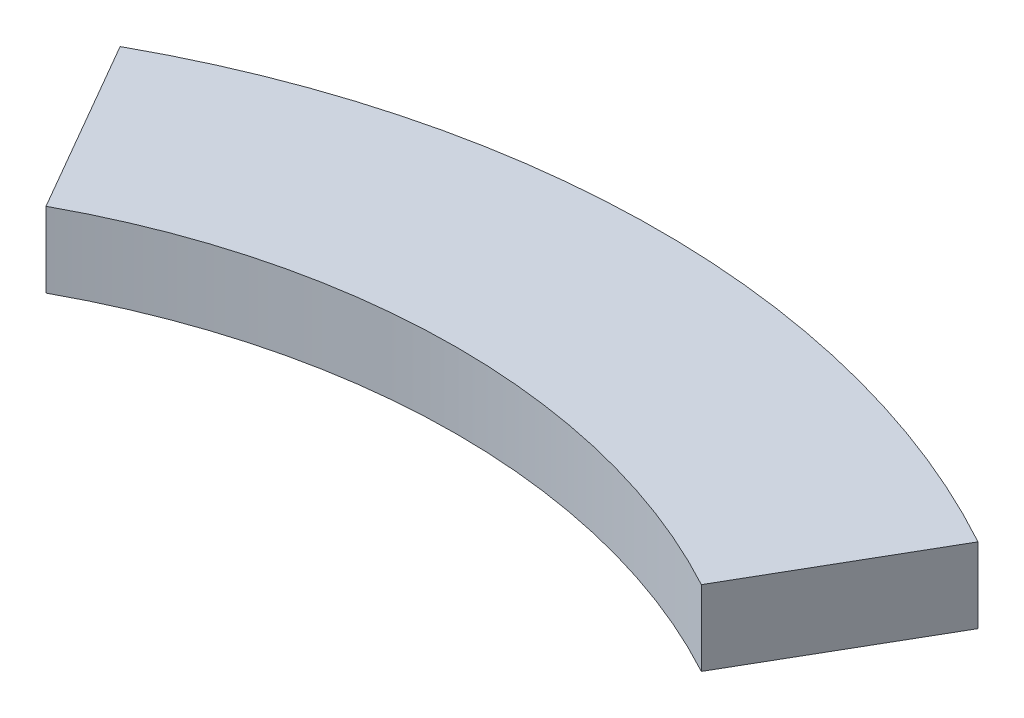
ISO-10303-21;
HEADER;
FILE_DESCRIPTION(('STEP AP214'),'2;1');
FILE_NAME('part.step','',(''),(''),'','','');
FILE_SCHEMA(('AUTOMOTIVE_DESIGN { 1 0 10303 214 1 1 1 1 }'));
ENDSEC;
DATA;
#1=APPLICATION_CONTEXT('core data for automotive mechanical design processes');
#2=APPLICATION_PROTOCOL_DEFINITION('international standard','automotive_design',2000,#1);
#3=PRODUCT_CONTEXT('',#1,'mechanical');
#4=PRODUCT('Part','Part','',(#3));
#5=PRODUCT_RELATED_PRODUCT_CATEGORY('part','',(#4));
#6=PRODUCT_DEFINITION_FORMATION('','',#4);
#7=PRODUCT_DEFINITION_CONTEXT('part definition',#1,'design');
#8=PRODUCT_DEFINITION('design','',#6,#7);
#9=PRODUCT_DEFINITION_SHAPE('','',#8);
#10=(LENGTH_UNIT() NAMED_UNIT(*) SI_UNIT(.MILLI.,.METRE.));
#11=(NAMED_UNIT(*) PLANE_ANGLE_UNIT() SI_UNIT($,.RADIAN.));
#12=(NAMED_UNIT(*) SI_UNIT($,.STERADIAN.) SOLID_ANGLE_UNIT());
#13=UNCERTAINTY_MEASURE_WITH_UNIT(LENGTH_MEASURE(1.E-05),#10,'distance_accuracy_value','');
#14=(GEOMETRIC_REPRESENTATION_CONTEXT(3) GLOBAL_UNCERTAINTY_ASSIGNED_CONTEXT((#13)) GLOBAL_UNIT_ASSIGNED_CONTEXT((#10,
#11,#12)) REPRESENTATION_CONTEXT('',''));
#15=CARTESIAN_POINT('',(0.,0.,0.));
#16=DIRECTION('',(0.,0.,1.));
#17=DIRECTION('',(1.,0.,0.));
#18=AXIS2_PLACEMENT_3D('',#15,#16,#17);
#19=CARTESIAN_POINT('',(0.,3.15,0.));
#20=DIRECTION('',(0.,-1.,0.));
#21=DIRECTION('',(0.,0.,-1.));
#22=AXIS2_PLACEMENT_3D('',#19,#20,#21);
#23=CYLINDRICAL_SURFACE('',#22,37.25);
#24=CARTESIAN_POINT('',(0.,0.,0.));
#25=DIRECTION('',(0.,1.,0.));
#26=DIRECTION('',(0.,0.,-1.));
#27=AXIS2_PLACEMENT_3D('',#24,#25,#26);
#28=CIRCLE('',#27,37.25);
#29=CARTESIAN_POINT('',(17.9717053966978,0.,-32.6279068457403));
#30=VERTEX_POINT('',#29);
#31=CARTESIAN_POINT('',(-17.9717053966979,0.,-32.6279068457402));
#32=VERTEX_POINT('',#31);
#33=EDGE_CURVE('E113',#30,#32,#28,.T.);
#34=ORIENTED_EDGE('',*,*,#33,.T.);
#35=DIRECTION('',(0.,-1.,0.));
#36=VECTOR('',#35,1.);
#37=CARTESIAN_POINT('',(-17.9717053966979,3.15,-32.6279068457402));
#38=LINE('',#37,#36);
#39=CARTESIAN_POINT('',(-17.9717053966979,3.15,-32.6279068457402));
#40=VERTEX_POINT('',#39);
#41=EDGE_CURVE('E11',#40,#32,#38,.T.);
#42=ORIENTED_EDGE('',*,*,#41,.F.);
#43=CARTESIAN_POINT('',(0.,3.15,0.));
#44=DIRECTION('',(0.,1.,0.));
#45=DIRECTION('',(0.,0.,-1.));
#46=AXIS2_PLACEMENT_3D('',#43,#44,#45);
#47=CIRCLE('',#46,37.25);
#48=CARTESIAN_POINT('',(17.9717053966978,3.15,-32.6279068457403));
#49=VERTEX_POINT('',#48);
#50=EDGE_CURVE('E97',#49,#40,#47,.T.);
#51=ORIENTED_EDGE('',*,*,#50,.F.);
#52=DIRECTION('',(0.,-1.,0.));
#53=VECTOR('',#52,1.);
#54=CARTESIAN_POINT('',(17.9717053966978,3.15,-32.6279068457403));
#55=LINE('',#54,#53);
#56=EDGE_CURVE('E109',#49,#30,#55,.T.);
#57=ORIENTED_EDGE('',*,*,#56,.T.);
#58=EDGE_LOOP('',(#34,#42,#51,#57));
#59=FACE_BOUND('',#58,.T.);
#60=ADVANCED_FACE('F45',(#59),#23,.T.);
#61=CARTESIAN_POINT('',(-17.9717053966979,3.15,-32.6279068457402));
#62=DIRECTION('',(0.866025403784436,0.,-0.500000000000004));
#63=DIRECTION('',(-0.500000000000004,0.,-0.866025403784436));
#64=AXIS2_PLACEMENT_3D('',#61,#62,#63);
#65=PLANE('',#64);
#66=DIRECTION('',(0.500000000000004,0.,0.866025403784436));
#67=VECTOR('',#66,1.);
#68=CARTESIAN_POINT('',(-17.9717053966979,0.,-32.6279068457402));
#69=LINE('',#68,#67);
#70=CARTESIAN_POINT('',(-13.7292564976257,0.,-25.2797698040326));
#71=VERTEX_POINT('',#70);
#72=EDGE_CURVE('E102',#32,#71,#69,.T.);
#73=ORIENTED_EDGE('',*,*,#72,.T.);
#74=DIRECTION('',(0.,-1.,0.));
#75=VECTOR('',#74,1.);
#76=CARTESIAN_POINT('',(-13.7292564976257,3.15,-25.2797698040326));
#77=LINE('',#76,#75);
#78=CARTESIAN_POINT('',(-13.7292564976257,3.15,-25.2797698040326));
#79=VERTEX_POINT('',#78);
#80=EDGE_CURVE('E54',#79,#71,#77,.T.);
#81=ORIENTED_EDGE('',*,*,#80,.F.);
#82=DIRECTION('',(0.500000000000004,0.,0.866025403784436));
#83=VECTOR('',#82,1.);
#84=CARTESIAN_POINT('',(-17.9717053966979,3.15,-32.6279068457402));
#85=LINE('',#84,#83);
#86=EDGE_CURVE('E92',#40,#79,#85,.T.);
#87=ORIENTED_EDGE('',*,*,#86,.F.);
#88=ORIENTED_EDGE('',*,*,#41,.T.);
#89=EDGE_LOOP('',(#73,#81,#87,#88));
#90=FACE_BOUND('',#89,.T.);
#91=ADVANCED_FACE('F101',(#90),#65,.F.);
#92=CARTESIAN_POINT('',(0.,3.15,0.));
#93=DIRECTION('',(0.,-1.,0.));
#94=DIRECTION('',(0.,0.,-1.));
#95=AXIS2_PLACEMENT_3D('',#92,#93,#94);
#96=CYLINDRICAL_SURFACE('',#95,28.7673294784635);
#97=CARTESIAN_POINT('',(0.,0.,0.));
#98=DIRECTION('',(0.,-1.,0.));
#99=DIRECTION('',(0.,0.,-1.));
#100=AXIS2_PLACEMENT_3D('',#97,#98,#99);
#101=CIRCLE('',#100,28.7673294784635);
#102=CARTESIAN_POINT('',(13.7292564976256,0.,-25.2797698040326));
#103=VERTEX_POINT('',#102);
#104=EDGE_CURVE('E79',#71,#103,#101,.T.);
#105=ORIENTED_EDGE('',*,*,#104,.T.);
#106=DIRECTION('',(0.,-1.,0.));
#107=VECTOR('',#106,1.);
#108=CARTESIAN_POINT('',(13.7292564976256,3.15,-25.2797698040326));
#109=LINE('',#108,#107);
#110=CARTESIAN_POINT('',(13.7292564976256,3.15,-25.2797698040326));
#111=VERTEX_POINT('',#110);
#112=EDGE_CURVE('E104',#111,#103,#109,.T.);
#113=ORIENTED_EDGE('',*,*,#112,.F.);
#114=CARTESIAN_POINT('',(0.,3.15,0.));
#115=DIRECTION('',(0.,-1.,0.));
#116=DIRECTION('',(0.,0.,-1.));
#117=AXIS2_PLACEMENT_3D('',#114,#115,#116);
#118=CIRCLE('',#117,28.7673294784635);
#119=EDGE_CURVE('E95',#79,#111,#118,.T.);
#120=ORIENTED_EDGE('',*,*,#119,.F.);
#121=ORIENTED_EDGE('',*,*,#80,.T.);
#122=EDGE_LOOP('',(#105,#113,#120,#121));
#123=FACE_BOUND('',#122,.T.);
#124=ADVANCED_FACE('F105',(#123),#96,.F.);
#125=CARTESIAN_POINT('',(17.9717053966978,3.15,-32.6279068457403));
#126=DIRECTION('',(-0.866025403784441,0.,-0.499999999999996));
#127=DIRECTION('',(-0.499999999999996,0.,0.866025403784441));
#128=AXIS2_PLACEMENT_3D('',#125,#126,#127);
#129=PLANE('',#128);
#130=DIRECTION('',(0.499999999999996,0.,-0.866025403784441));
#131=VECTOR('',#130,1.);
#132=CARTESIAN_POINT('',(17.9717053966978,0.,-32.6279068457403));
#133=LINE('',#132,#131);
#134=EDGE_CURVE('E85',#103,#30,#133,.T.);
#135=ORIENTED_EDGE('',*,*,#134,.T.);
#136=ORIENTED_EDGE('',*,*,#56,.F.);
#137=DIRECTION('',(0.499999999999996,0.,-0.866025403784441));
#138=VECTOR('',#137,1.);
#139=CARTESIAN_POINT('',(17.9717053966978,3.15,-32.6279068457403));
#140=LINE('',#139,#138);
#141=EDGE_CURVE('E62',#111,#49,#140,.T.);
#142=ORIENTED_EDGE('',*,*,#141,.F.);
#143=ORIENTED_EDGE('',*,*,#112,.T.);
#144=EDGE_LOOP('',(#135,#136,#142,#143));
#145=FACE_BOUND('',#144,.T.);
#146=ADVANCED_FACE('F127',(#145),#129,.F.);
#147=CARTESIAN_POINT('',(0.,3.15,0.));
#148=DIRECTION('',(0.,-1.,0.));
#149=DIRECTION('',(0.,0.,-1.));
#150=AXIS2_PLACEMENT_3D('',#147,#148,#149);
#151=PLANE('',#150);
#152=ORIENTED_EDGE('',*,*,#50,.T.);
#153=ORIENTED_EDGE('',*,*,#86,.T.);
#154=ORIENTED_EDGE('',*,*,#119,.T.);
#155=ORIENTED_EDGE('',*,*,#141,.T.);
#156=EDGE_LOOP('',(#152,#153,#154,#155));
#157=FACE_BOUND('',#156,.T.);
#158=ADVANCED_FACE('F93',(#157),#151,.F.);
#159=CARTESIAN_POINT('',(0.,0.,0.));
#160=DIRECTION('',(0.,-1.,0.));
#161=DIRECTION('',(0.,0.,-1.));
#162=AXIS2_PLACEMENT_3D('',#159,#160,#161);
#163=PLANE('',#162);
#164=CARTESIAN_POINT('',(0.,0.,-33.0086647392318));
#165=DIRECTION('',(0.,-1.,0.));
#166=DIRECTION('',(0.,0.,-1.));
#167=AXIS2_PLACEMENT_3D('',#164,#165,#166);
#168=CIRCLE('',#167,1.625);
#169=CARTESIAN_POINT('',(0.,0.,-34.6336647392318));
#170=VERTEX_POINT('',#169);
#171=EDGE_CURVE('E134',#170,#170,#168,.T.);
#172=ORIENTED_EDGE('',*,*,#171,.F.);
#173=EDGE_LOOP('',(#172));
#174=FACE_BOUND('',#173,.T.);
#175=ORIENTED_EDGE('',*,*,#33,.F.);
#176=ORIENTED_EDGE('',*,*,#134,.F.);
#177=ORIENTED_EDGE('',*,*,#104,.F.);
#178=ORIENTED_EDGE('',*,*,#72,.F.);
#179=EDGE_LOOP('',(#175,#176,#177,#178));
#180=FACE_BOUND('',#179,.T.);
#181=ADVANCED_FACE('F130',(#174,#180),#163,.T.);
#182=CARTESIAN_POINT('',(0.,2.,-33.0086647392318));
#183=DIRECTION('',(0.,-1.,0.));
#184=DIRECTION('',(0.,0.,-1.));
#185=AXIS2_PLACEMENT_3D('',#182,#183,#184);
#186=CYLINDRICAL_SURFACE('',#185,1.625);
#187=CARTESIAN_POINT('',(0.,2.,-33.0086647392318));
#188=DIRECTION('',(0.,-1.,0.));
#189=DIRECTION('',(0.,0.,-1.));
#190=AXIS2_PLACEMENT_3D('',#187,#188,#189);
#191=CIRCLE('',#190,1.625);
#192=CARTESIAN_POINT('',(0.,2.,-34.6336647392318));
#193=VERTEX_POINT('',#192);
#194=EDGE_CURVE('E117',#193,#193,#191,.T.);
#195=ORIENTED_EDGE('',*,*,#194,.F.);
#196=EDGE_LOOP('',(#195));
#197=FACE_BOUND('',#196,.T.);
#198=ORIENTED_EDGE('',*,*,#171,.T.);
#199=EDGE_LOOP('',(#198));
#200=FACE_BOUND('',#199,.T.);
#201=ADVANCED_FACE('F144',(#197,#200),#186,.F.);
#202=CARTESIAN_POINT('',(0.,2.,-33.0086647392318));
#203=DIRECTION('',(0.,-1.,0.));
#204=DIRECTION('',(0.,0.,-1.));
#205=AXIS2_PLACEMENT_3D('',#202,#203,#204);
#206=PLANE('',#205);
#207=ORIENTED_EDGE('',*,*,#194,.T.);
#208=EDGE_LOOP('',(#207));
#209=FACE_BOUND('',#208,.T.);
#210=ADVANCED_FACE('F142',(#209),#206,.T.);
#211=CLOSED_SHELL('',(#60,#91,#124,#146,#158,#181,#201,#210));
#212=MANIFOLD_SOLID_BREP('B2',#211);
#213=ADVANCED_BREP_SHAPE_REPRESENTATION('',(#18,#212),#14);
#214=SHAPE_DEFINITION_REPRESENTATION(#9,#213);
ENDSEC;
END-ISO-10303-21;
